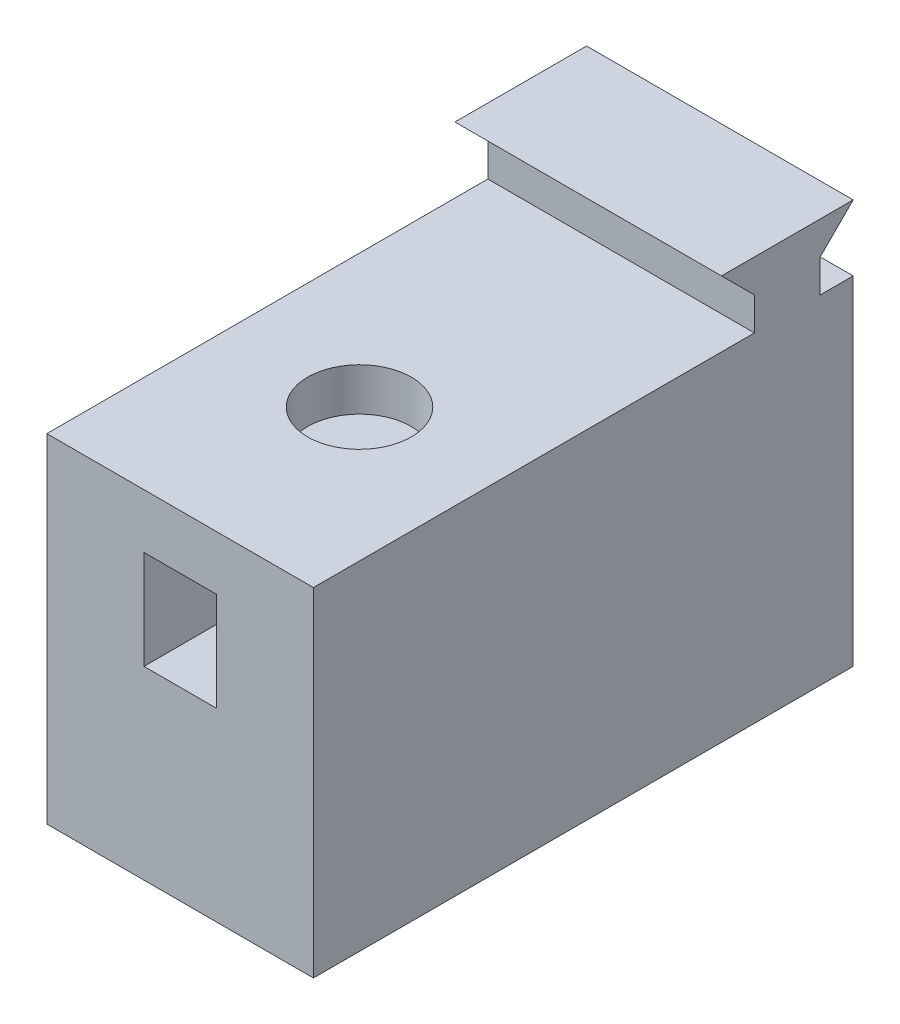
ISO-10303-21;
HEADER;
FILE_DESCRIPTION(('STEP AP214'),'2;1');
FILE_NAME('part.step','',(''),(''),'','','');
FILE_SCHEMA(('AUTOMOTIVE_DESIGN { 1 0 10303 214 1 1 1 1 }'));
ENDSEC;
DATA;
#1=APPLICATION_CONTEXT('core data for automotive mechanical design processes');
#2=APPLICATION_PROTOCOL_DEFINITION('international standard','automotive_design',2000,#1);
#3=PRODUCT_CONTEXT('',#1,'mechanical');
#4=PRODUCT('Part','Part','',(#3));
#5=PRODUCT_RELATED_PRODUCT_CATEGORY('part','',(#4));
#6=PRODUCT_DEFINITION_FORMATION('','',#4);
#7=PRODUCT_DEFINITION_CONTEXT('part definition',#1,'design');
#8=PRODUCT_DEFINITION('design','',#6,#7);
#9=PRODUCT_DEFINITION_SHAPE('','',#8);
#10=(LENGTH_UNIT() NAMED_UNIT(*) SI_UNIT(.MILLI.,.METRE.));
#11=(NAMED_UNIT(*) PLANE_ANGLE_UNIT() SI_UNIT($,.RADIAN.));
#12=(NAMED_UNIT(*) SI_UNIT($,.STERADIAN.) SOLID_ANGLE_UNIT());
#13=UNCERTAINTY_MEASURE_WITH_UNIT(LENGTH_MEASURE(1.E-05),#10,'distance_accuracy_value','');
#14=(GEOMETRIC_REPRESENTATION_CONTEXT(3) GLOBAL_UNCERTAINTY_ASSIGNED_CONTEXT((#13)) GLOBAL_UNIT_ASSIGNED_CONTEXT((#10,
#11,#12)) REPRESENTATION_CONTEXT('',''));
#15=CARTESIAN_POINT('',(0.,0.,0.));
#16=DIRECTION('',(0.,0.,1.));
#17=DIRECTION('',(1.,0.,0.));
#18=AXIS2_PLACEMENT_3D('',#15,#16,#17);
#19=CARTESIAN_POINT('',(0.,-45.8,0.));
#20=DIRECTION('',(0.,-1.,0.));
#21=DIRECTION('',(0.,0.,-1.));
#22=AXIS2_PLACEMENT_3D('',#19,#20,#21);
#23=PLANE('',#22);
#24=DIRECTION('',(-1.,0.,0.));
#25=VECTOR('',#24,1.);
#26=CARTESIAN_POINT('',(0.,-45.8,-19.9));
#27=LINE('',#26,#25);
#28=CARTESIAN_POINT('',(-76.9,-45.8,-19.9));
#29=VERTEX_POINT('',#28);
#30=CARTESIAN_POINT('',(-93.1,-45.8,-19.9));
#31=VERTEX_POINT('',#30);
#32=EDGE_CURVE('E11',#29,#31,#27,.T.);
#33=ORIENTED_EDGE('',*,*,#32,.F.);
#34=DIRECTION('',(0.,0.,-1.));
#35=VECTOR('',#34,1.);
#36=CARTESIAN_POINT('',(-76.9,-45.8,10.9));
#37=LINE('',#36,#35);
#38=CARTESIAN_POINT('',(-76.9,-45.8,-21.9));
#39=VERTEX_POINT('',#38);
#40=EDGE_CURVE('E333',#29,#39,#37,.T.);
#41=ORIENTED_EDGE('',*,*,#40,.T.);
#42=DIRECTION('',(-1.,0.,0.));
#43=VECTOR('',#42,1.);
#44=CARTESIAN_POINT('',(-93.1,-45.8,-21.9));
#45=LINE('',#44,#43);
#46=CARTESIAN_POINT('',(-93.1,-45.8,-21.9));
#47=VERTEX_POINT('',#46);
#48=EDGE_CURVE('E337',#39,#47,#45,.T.);
#49=ORIENTED_EDGE('',*,*,#48,.T.);
#50=DIRECTION('',(0.,0.,1.));
#51=VECTOR('',#50,1.);
#52=CARTESIAN_POINT('',(-93.1,-45.8,10.9));
#53=LINE('',#52,#51);
#54=EDGE_CURVE('E326',#47,#31,#53,.T.);
#55=ORIENTED_EDGE('',*,*,#54,.T.);
#56=EDGE_LOOP('',(#33,#41,#49,#55));
#57=FACE_BOUND('',#56,.T.);
#58=ADVANCED_FACE('F39',(#57),#23,.F.);
#59=CARTESIAN_POINT('',(-85.,-45.8,0.));
#60=DIRECTION('',(0.,1.,0.));
#61=DIRECTION('',(0.,0.,1.));
#62=AXIS2_PLACEMENT_3D('',#59,#60,#61);
#63=CIRCLE('',#62,3.15);
#64=CARTESIAN_POINT('',(-85.,-45.8,3.15));
#65=VERTEX_POINT('',#64);
#66=EDGE_CURVE('E204',#65,#65,#63,.T.);
#67=ORIENTED_EDGE('',*,*,#66,.F.);
#68=EDGE_LOOP('',(#67));
#69=FACE_BOUND('',#68,.T.);
#70=DIRECTION('',(1.,0.,0.));
#71=VECTOR('',#70,1.);
#72=CARTESIAN_POINT('',(0.,-45.8,-15.9));
#73=LINE('',#72,#71);
#74=CARTESIAN_POINT('',(-93.1,-45.8,-15.9));
#75=VERTEX_POINT('',#74);
#76=CARTESIAN_POINT('',(-76.9,-45.8,-15.9));
#77=VERTEX_POINT('',#76);
#78=EDGE_CURVE('E48',#75,#77,#73,.T.);
#79=ORIENTED_EDGE('',*,*,#78,.F.);
#80=CARTESIAN_POINT('',(-93.1,-45.8,10.9));
#81=VERTEX_POINT('',#80);
#82=EDGE_CURVE('E330',#75,#81,#53,.T.);
#83=ORIENTED_EDGE('',*,*,#82,.T.);
#84=DIRECTION('',(1.,0.,0.));
#85=VECTOR('',#84,1.);
#86=CARTESIAN_POINT('',(-93.1,-45.8,10.9));
#87=LINE('',#86,#85);
#88=CARTESIAN_POINT('',(-76.9,-45.8,10.9));
#89=VERTEX_POINT('',#88);
#90=EDGE_CURVE('E329',#81,#89,#87,.T.);
#91=ORIENTED_EDGE('',*,*,#90,.T.);
#92=EDGE_CURVE('E334',#89,#77,#37,.T.);
#93=ORIENTED_EDGE('',*,*,#92,.T.);
#94=EDGE_LOOP('',(#79,#83,#91,#93));
#95=FACE_BOUND('',#94,.T.);
#96=ADVANCED_FACE('F423',(#69,#95),#23,.F.);
#97=CARTESIAN_POINT('',(-93.1,-45.8,10.9));
#98=DIRECTION('',(1.,0.,0.));
#99=DIRECTION('',(0.,0.,-1.));
#100=AXIS2_PLACEMENT_3D('',#97,#98,#99);
#101=PLANE('',#100);
#102=ORIENTED_EDGE('',*,*,#82,.F.);
#103=DIRECTION('',(0.,-1.,0.));
#104=VECTOR('',#103,1.);
#105=CARTESIAN_POINT('',(-93.1,-46.3,-15.9));
#106=LINE('',#105,#104);
#107=CARTESIAN_POINT('',(-93.1,-43.8,-15.9));
#108=VERTEX_POINT('',#107);
#109=EDGE_CURVE('E282',#108,#75,#106,.T.);
#110=ORIENTED_EDGE('',*,*,#109,.F.);
#111=DIRECTION('',(0.,-0.707106781186546,-0.707106781186549));
#112=VECTOR('',#111,1.);
#113=CARTESIAN_POINT('',(-93.1,-43.8,-15.9));
#114=LINE('',#113,#112);
#115=CARTESIAN_POINT('',(-93.1,-41.8,-13.9));
#116=VERTEX_POINT('',#115);
#117=EDGE_CURVE('E304',#116,#108,#114,.T.);
#118=ORIENTED_EDGE('',*,*,#117,.F.);
#119=DIRECTION('',(0.,0.,1.));
#120=VECTOR('',#119,1.);
#121=CARTESIAN_POINT('',(-93.1,-41.8,-13.9));
#122=LINE('',#121,#120);
#123=CARTESIAN_POINT('',(-93.1,-41.8,-21.9));
#124=VERTEX_POINT('',#123);
#125=EDGE_CURVE('E301',#124,#116,#122,.T.);
#126=ORIENTED_EDGE('',*,*,#125,.F.);
#127=DIRECTION('',(0.,0.707106781186554,-0.707106781186541));
#128=VECTOR('',#127,1.);
#129=CARTESIAN_POINT('',(-93.1,-41.8,-21.9));
#130=LINE('',#129,#128);
#131=CARTESIAN_POINT('',(-93.1,-43.8,-19.9));
#132=VERTEX_POINT('',#131);
#133=EDGE_CURVE('E298',#132,#124,#130,.T.);
#134=ORIENTED_EDGE('',*,*,#133,.F.);
#135=DIRECTION('',(0.,1.,0.));
#136=VECTOR('',#135,1.);
#137=CARTESIAN_POINT('',(-93.1,-43.8,-19.9));
#138=LINE('',#137,#136);
#139=EDGE_CURVE('E268',#31,#132,#138,.T.);
#140=ORIENTED_EDGE('',*,*,#139,.F.);
#141=ORIENTED_EDGE('',*,*,#54,.F.);
#142=DIRECTION('',(0.,-1.,0.));
#143=VECTOR('',#142,1.);
#144=CARTESIAN_POINT('',(-93.1,-45.8,-21.9));
#145=LINE('',#144,#143);
#146=CARTESIAN_POINT('',(-93.1,-66.35,-21.9));
#147=VERTEX_POINT('',#146);
#148=EDGE_CURVE('E340',#47,#147,#145,.T.);
#149=ORIENTED_EDGE('',*,*,#148,.T.);
#150=DIRECTION('',(0.,0.,1.));
#151=VECTOR('',#150,1.);
#152=CARTESIAN_POINT('',(-93.1,-66.35,10.9));
#153=LINE('',#152,#151);
#154=CARTESIAN_POINT('',(-93.1,-66.35,10.9));
#155=VERTEX_POINT('',#154);
#156=EDGE_CURVE('E325',#147,#155,#153,.T.);
#157=ORIENTED_EDGE('',*,*,#156,.T.);
#158=DIRECTION('',(0.,-1.,0.));
#159=VECTOR('',#158,1.);
#160=CARTESIAN_POINT('',(-93.1,-45.8,10.9));
#161=LINE('',#160,#159);
#162=EDGE_CURVE('E364',#81,#155,#161,.T.);
#163=ORIENTED_EDGE('',*,*,#162,.F.);
#164=EDGE_LOOP('',(#102,#110,#118,#126,#134,#140,#141,#149,#157,#163));
#165=FACE_BOUND('',#164,.T.);
#166=ADVANCED_FACE('F41',(#165),#101,.F.);
#167=CARTESIAN_POINT('',(-93.1,-45.8,10.9));
#168=DIRECTION('',(0.,0.,-1.));
#169=DIRECTION('',(-1.,0.,0.));
#170=AXIS2_PLACEMENT_3D('',#167,#168,#169);
#171=PLANE('',#170);
#172=DIRECTION('',(1.,0.,0.));
#173=VECTOR('',#172,1.);
#174=CARTESIAN_POINT('',(-87.2,-55.1,10.9));
#175=LINE('',#174,#173);
#176=CARTESIAN_POINT('',(-87.2,-55.1,10.9));
#177=VERTEX_POINT('',#176);
#178=CARTESIAN_POINT('',(-82.8,-55.1,10.9));
#179=VERTEX_POINT('',#178);
#180=EDGE_CURVE('E195',#177,#179,#175,.T.);
#181=ORIENTED_EDGE('',*,*,#180,.F.);
#182=DIRECTION('',(0.,-1.,0.));
#183=VECTOR('',#182,1.);
#184=CARTESIAN_POINT('',(-87.2,-55.1,10.9));
#185=LINE('',#184,#183);
#186=CARTESIAN_POINT('',(-87.2,-49.1,10.9));
#187=VERTEX_POINT('',#186);
#188=EDGE_CURVE('E55',#187,#177,#185,.T.);
#189=ORIENTED_EDGE('',*,*,#188,.F.);
#190=DIRECTION('',(-1.,0.,0.));
#191=VECTOR('',#190,1.);
#192=CARTESIAN_POINT('',(-87.2,-49.1,10.9));
#193=LINE('',#192,#191);
#194=CARTESIAN_POINT('',(-82.8,-49.1,10.9));
#195=VERTEX_POINT('',#194);
#196=EDGE_CURVE('E184',#195,#187,#193,.T.);
#197=ORIENTED_EDGE('',*,*,#196,.F.);
#198=DIRECTION('',(0.,1.,0.));
#199=VECTOR('',#198,1.);
#200=CARTESIAN_POINT('',(-82.8,-55.1,10.9));
#201=LINE('',#200,#199);
#202=EDGE_CURVE('E188',#179,#195,#201,.T.);
#203=ORIENTED_EDGE('',*,*,#202,.F.);
#204=EDGE_LOOP('',(#181,#189,#197,#203));
#205=FACE_BOUND('',#204,.T.);
#206=DIRECTION('',(1.,0.,0.));
#207=VECTOR('',#206,1.);
#208=CARTESIAN_POINT('',(-93.1,-66.35,10.9));
#209=LINE('',#208,#207);
#210=CARTESIAN_POINT('',(-76.9,-66.35,10.9));
#211=VERTEX_POINT('',#210);
#212=EDGE_CURVE('E344',#155,#211,#209,.T.);
#213=ORIENTED_EDGE('',*,*,#212,.T.);
#214=DIRECTION('',(0.,-1.,0.));
#215=VECTOR('',#214,1.);
#216=CARTESIAN_POINT('',(-76.9,-45.8,10.9));
#217=LINE('',#216,#215);
#218=EDGE_CURVE('E360',#89,#211,#217,.T.);
#219=ORIENTED_EDGE('',*,*,#218,.F.);
#220=ORIENTED_EDGE('',*,*,#90,.F.);
#221=ORIENTED_EDGE('',*,*,#162,.T.);
#222=EDGE_LOOP('',(#213,#219,#220,#221));
#223=FACE_BOUND('',#222,.T.);
#224=ADVANCED_FACE('F442',(#205,#223),#171,.F.);
#225=CARTESIAN_POINT('',(-76.9,-45.8,10.9));
#226=DIRECTION('',(-1.,0.,0.));
#227=DIRECTION('',(0.,0.,1.));
#228=AXIS2_PLACEMENT_3D('',#225,#226,#227);
#229=PLANE('',#228);
#230=ORIENTED_EDGE('',*,*,#40,.F.);
#231=DIRECTION('',(0.,1.,0.));
#232=VECTOR('',#231,1.);
#233=CARTESIAN_POINT('',(-76.9,-43.8,-19.9));
#234=LINE('',#233,#232);
#235=CARTESIAN_POINT('',(-76.9,-43.8,-19.9));
#236=VERTEX_POINT('',#235);
#237=EDGE_CURVE('E278',#29,#236,#234,.T.);
#238=ORIENTED_EDGE('',*,*,#237,.T.);
#239=DIRECTION('',(0.,0.707106781186554,-0.707106781186541));
#240=VECTOR('',#239,1.);
#241=CARTESIAN_POINT('',(-76.9,-41.8,-21.9));
#242=LINE('',#241,#240);
#243=CARTESIAN_POINT('',(-76.9,-41.8,-21.9));
#244=VERTEX_POINT('',#243);
#245=EDGE_CURVE('E281',#236,#244,#242,.T.);
#246=ORIENTED_EDGE('',*,*,#245,.T.);
#247=DIRECTION('',(0.,0.,1.));
#248=VECTOR('',#247,1.);
#249=CARTESIAN_POINT('',(-76.9,-41.8,-13.9));
#250=LINE('',#249,#248);
#251=CARTESIAN_POINT('',(-76.9,-41.8,-13.9));
#252=VERTEX_POINT('',#251);
#253=EDGE_CURVE('E285',#244,#252,#250,.T.);
#254=ORIENTED_EDGE('',*,*,#253,.T.);
#255=DIRECTION('',(0.,-0.707106781186546,-0.707106781186549));
#256=VECTOR('',#255,1.);
#257=CARTESIAN_POINT('',(-76.9,-43.8,-15.9));
#258=LINE('',#257,#256);
#259=CARTESIAN_POINT('',(-76.9,-43.8,-15.9));
#260=VERTEX_POINT('',#259);
#261=EDGE_CURVE('E288',#252,#260,#258,.T.);
#262=ORIENTED_EDGE('',*,*,#261,.T.);
#263=DIRECTION('',(0.,-1.,0.));
#264=VECTOR('',#263,1.);
#265=CARTESIAN_POINT('',(-76.9,-46.3,-15.9));
#266=LINE('',#265,#264);
#267=EDGE_CURVE('E291',#260,#77,#266,.T.);
#268=ORIENTED_EDGE('',*,*,#267,.T.);
#269=ORIENTED_EDGE('',*,*,#92,.F.);
#270=ORIENTED_EDGE('',*,*,#218,.T.);
#271=DIRECTION('',(0.,0.,-1.));
#272=VECTOR('',#271,1.);
#273=CARTESIAN_POINT('',(-76.9,-66.35,10.9));
#274=LINE('',#273,#272);
#275=CARTESIAN_POINT('',(-76.9,-66.35,-21.9));
#276=VERTEX_POINT('',#275);
#277=EDGE_CURVE('E347',#211,#276,#274,.T.);
#278=ORIENTED_EDGE('',*,*,#277,.T.);
#279=DIRECTION('',(0.,-1.,0.));
#280=VECTOR('',#279,1.);
#281=CARTESIAN_POINT('',(-76.9,-45.8,-21.9));
#282=LINE('',#281,#280);
#283=EDGE_CURVE('E356',#39,#276,#282,.T.);
#284=ORIENTED_EDGE('',*,*,#283,.F.);
#285=EDGE_LOOP('',(#230,#238,#246,#254,#262,#268,#269,#270,#278,#284));
#286=FACE_BOUND('',#285,.T.);
#287=ADVANCED_FACE('F378',(#286),#229,.F.);
#288=CARTESIAN_POINT('',(-93.1,-45.8,-21.9));
#289=DIRECTION('',(0.,0.,1.));
#290=DIRECTION('',(1.,0.,0.));
#291=AXIS2_PLACEMENT_3D('',#288,#289,#290);
#292=PLANE('',#291);
#293=DIRECTION('',(-1.,0.,0.));
#294=VECTOR('',#293,1.);
#295=CARTESIAN_POINT('',(-93.1,-66.35,-21.9));
#296=LINE('',#295,#294);
#297=EDGE_CURVE('E350',#276,#147,#296,.T.);
#298=ORIENTED_EDGE('',*,*,#297,.T.);
#299=ORIENTED_EDGE('',*,*,#148,.F.);
#300=ORIENTED_EDGE('',*,*,#48,.F.);
#301=ORIENTED_EDGE('',*,*,#283,.T.);
#302=EDGE_LOOP('',(#298,#299,#300,#301));
#303=FACE_BOUND('',#302,.T.);
#304=ADVANCED_FACE('F436',(#303),#292,.F.);
#305=CARTESIAN_POINT('',(0.,-66.35,0.));
#306=DIRECTION('',(0.,-1.,0.));
#307=DIRECTION('',(0.,0.,-1.));
#308=AXIS2_PLACEMENT_3D('',#305,#306,#307);
#309=PLANE('',#308);
#310=CARTESIAN_POINT('',(-85.,-66.35,8.25));
#311=DIRECTION('',(0.,1.,0.));
#312=DIRECTION('',(0.,0.,1.));
#313=AXIS2_PLACEMENT_3D('',#310,#311,#312);
#314=CIRCLE('',#313,1.);
#315=CARTESIAN_POINT('',(-85.,-66.35,9.25));
#316=VERTEX_POINT('',#315);
#317=EDGE_CURVE('E218',#316,#316,#314,.T.);
#318=ORIENTED_EDGE('',*,*,#317,.T.);
#319=EDGE_LOOP('',(#318));
#320=FACE_BOUND('',#319,.T.);
#321=CARTESIAN_POINT('',(-85.,-66.35,-19.25));
#322=DIRECTION('',(0.,1.,0.));
#323=DIRECTION('',(0.,0.,1.));
#324=AXIS2_PLACEMENT_3D('',#321,#322,#323);
#325=CIRCLE('',#324,1.);
#326=CARTESIAN_POINT('',(-85.,-66.35,-18.25));
#327=VERTEX_POINT('',#326);
#328=EDGE_CURVE('E226',#327,#327,#325,.T.);
#329=ORIENTED_EDGE('',*,*,#328,.T.);
#330=EDGE_LOOP('',(#329));
#331=FACE_BOUND('',#330,.T.);
#332=DIRECTION('',(0.,0.,1.));
#333=VECTOR('',#332,1.);
#334=CARTESIAN_POINT('',(-91.5,-66.35,6.1));
#335=LINE('',#334,#333);
#336=CARTESIAN_POINT('',(-91.5,-66.35,-17.1));
#337=VERTEX_POINT('',#336);
#338=CARTESIAN_POINT('',(-91.5,-66.35,6.1));
#339=VERTEX_POINT('',#338);
#340=EDGE_CURVE('E234',#337,#339,#335,.T.);
#341=ORIENTED_EDGE('',*,*,#340,.T.);
#342=DIRECTION('',(1.,0.,0.));
#343=VECTOR('',#342,1.);
#344=CARTESIAN_POINT('',(-91.5,-66.35,6.1));
#345=LINE('',#344,#343);
#346=CARTESIAN_POINT('',(-78.5,-66.35,6.1));
#347=VERTEX_POINT('',#346);
#348=EDGE_CURVE('E238',#339,#347,#345,.T.);
#349=ORIENTED_EDGE('',*,*,#348,.T.);
#350=DIRECTION('',(0.,0.,-1.));
#351=VECTOR('',#350,1.);
#352=CARTESIAN_POINT('',(-78.5,-66.35,6.1));
#353=LINE('',#352,#351);
#354=CARTESIAN_POINT('',(-78.5,-66.35,-17.1));
#355=VERTEX_POINT('',#354);
#356=EDGE_CURVE('E243',#347,#355,#353,.T.);
#357=ORIENTED_EDGE('',*,*,#356,.T.);
#358=DIRECTION('',(-1.,0.,0.));
#359=VECTOR('',#358,1.);
#360=CARTESIAN_POINT('',(-91.5,-66.35,-17.1));
#361=LINE('',#360,#359);
#362=EDGE_CURVE('E247',#355,#337,#361,.T.);
#363=ORIENTED_EDGE('',*,*,#362,.T.);
#364=EDGE_LOOP('',(#341,#349,#357,#363));
#365=FACE_BOUND('',#364,.T.);
#366=ORIENTED_EDGE('',*,*,#156,.F.);
#367=ORIENTED_EDGE('',*,*,#297,.F.);
#368=ORIENTED_EDGE('',*,*,#277,.F.);
#369=ORIENTED_EDGE('',*,*,#212,.F.);
#370=EDGE_LOOP('',(#366,#367,#368,#369));
#371=FACE_BOUND('',#370,.T.);
#372=ADVANCED_FACE('F407',(#320,#331,#365,#371),#309,.T.);
#373=CARTESIAN_POINT('',(-76.9,-43.8,-19.9));
#374=DIRECTION('',(0.,0.,1.));
#375=DIRECTION('',(1.,0.,0.));
#376=AXIS2_PLACEMENT_3D('',#373,#374,#375);
#377=PLANE('',#376);
#378=ORIENTED_EDGE('',*,*,#237,.F.);
#379=ORIENTED_EDGE('',*,*,#32,.T.);
#380=ORIENTED_EDGE('',*,*,#139,.T.);
#381=DIRECTION('',(-1.,0.,0.));
#382=VECTOR('',#381,1.);
#383=CARTESIAN_POINT('',(-76.9,-43.8,-19.9));
#384=LINE('',#383,#382);
#385=EDGE_CURVE('E321',#236,#132,#384,.T.);
#386=ORIENTED_EDGE('',*,*,#385,.F.);
#387=EDGE_LOOP('',(#378,#379,#380,#386));
#388=FACE_BOUND('',#387,.T.);
#389=ADVANCED_FACE('F432',(#388),#377,.F.);
#390=CARTESIAN_POINT('',(-76.9,-46.3,-15.9));
#391=DIRECTION('',(0.,0.,-1.));
#392=DIRECTION('',(-1.,0.,0.));
#393=AXIS2_PLACEMENT_3D('',#390,#391,#392);
#394=PLANE('',#393);
#395=ORIENTED_EDGE('',*,*,#109,.T.);
#396=ORIENTED_EDGE('',*,*,#78,.T.);
#397=ORIENTED_EDGE('',*,*,#267,.F.);
#398=DIRECTION('',(-1.,0.,0.));
#399=VECTOR('',#398,1.);
#400=CARTESIAN_POINT('',(-76.9,-43.8,-15.9));
#401=LINE('',#400,#399);
#402=EDGE_CURVE('E295',#260,#108,#401,.T.);
#403=ORIENTED_EDGE('',*,*,#402,.T.);
#404=EDGE_LOOP('',(#395,#396,#397,#403));
#405=FACE_BOUND('',#404,.T.);
#406=ADVANCED_FACE('F372',(#405),#394,.F.);
#407=CARTESIAN_POINT('',(-76.9,-41.8,-21.9));
#408=DIRECTION('',(0.,0.707106781186541,0.707106781186554));
#409=DIRECTION('',(0.,-0.707106781186554,0.707106781186541));
#410=AXIS2_PLACEMENT_3D('',#407,#408,#409);
#411=PLANE('',#410);
#412=ORIENTED_EDGE('',*,*,#133,.T.);
#413=DIRECTION('',(-1.,0.,0.));
#414=VECTOR('',#413,1.);
#415=CARTESIAN_POINT('',(-76.9,-41.8,-21.9));
#416=LINE('',#415,#414);
#417=EDGE_CURVE('E317',#244,#124,#416,.T.);
#418=ORIENTED_EDGE('',*,*,#417,.F.);
#419=ORIENTED_EDGE('',*,*,#245,.F.);
#420=ORIENTED_EDGE('',*,*,#385,.T.);
#421=EDGE_LOOP('',(#412,#418,#419,#420));
#422=FACE_BOUND('',#421,.T.);
#423=ADVANCED_FACE('F466',(#422),#411,.F.);
#424=CARTESIAN_POINT('',(-76.9,-41.8,-13.9));
#425=DIRECTION('',(0.,-1.,0.));
#426=DIRECTION('',(0.,0.,-1.));
#427=AXIS2_PLACEMENT_3D('',#424,#425,#426);
#428=PLANE('',#427);
#429=ORIENTED_EDGE('',*,*,#125,.T.);
#430=DIRECTION('',(-1.,0.,0.));
#431=VECTOR('',#430,1.);
#432=CARTESIAN_POINT('',(-76.9,-41.8,-13.9));
#433=LINE('',#432,#431);
#434=EDGE_CURVE('E313',#252,#116,#433,.T.);
#435=ORIENTED_EDGE('',*,*,#434,.F.);
#436=ORIENTED_EDGE('',*,*,#253,.F.);
#437=ORIENTED_EDGE('',*,*,#417,.T.);
#438=EDGE_LOOP('',(#429,#435,#436,#437));
#439=FACE_BOUND('',#438,.T.);
#440=ADVANCED_FACE('F418',(#439),#428,.F.);
#441=CARTESIAN_POINT('',(-76.9,-43.8,-15.9));
#442=DIRECTION('',(0.,0.707106781186549,-0.707106781186546));
#443=DIRECTION('',(0.,0.707106781186546,0.707106781186549));
#444=AXIS2_PLACEMENT_3D('',#441,#442,#443);
#445=PLANE('',#444);
#446=ORIENTED_EDGE('',*,*,#117,.T.);
#447=ORIENTED_EDGE('',*,*,#402,.F.);
#448=ORIENTED_EDGE('',*,*,#261,.F.);
#449=ORIENTED_EDGE('',*,*,#434,.T.);
#450=EDGE_LOOP('',(#446,#447,#448,#449));
#451=FACE_BOUND('',#450,.T.);
#452=ADVANCED_FACE('F384',(#451),#445,.F.);
#453=CARTESIAN_POINT('',(-91.5,-66.35,6.1));
#454=DIRECTION('',(-1.,0.,0.));
#455=DIRECTION('',(0.,0.,1.));
#456=AXIS2_PLACEMENT_3D('',#453,#454,#455);
#457=PLANE('',#456);
#458=DIRECTION('',(0.,0.,1.));
#459=VECTOR('',#458,1.);
#460=CARTESIAN_POINT('',(-91.5,-49.1,6.1));
#461=LINE('',#460,#459);
#462=CARTESIAN_POINT('',(-91.5,-49.1,-17.1));
#463=VERTEX_POINT('',#462);
#464=CARTESIAN_POINT('',(-91.5,-49.1,6.1));
#465=VERTEX_POINT('',#464);
#466=EDGE_CURVE('E230',#463,#465,#461,.T.);
#467=ORIENTED_EDGE('',*,*,#466,.T.);
#468=DIRECTION('',(0.,1.,0.));
#469=VECTOR('',#468,1.);
#470=CARTESIAN_POINT('',(-91.5,-66.35,6.1));
#471=LINE('',#470,#469);
#472=EDGE_CURVE('E251',#339,#465,#471,.T.);
#473=ORIENTED_EDGE('',*,*,#472,.F.);
#474=ORIENTED_EDGE('',*,*,#340,.F.);
#475=DIRECTION('',(0.,1.,0.));
#476=VECTOR('',#475,1.);
#477=CARTESIAN_POINT('',(-91.5,-66.35,-17.1));
#478=LINE('',#477,#476);
#479=EDGE_CURVE('E265',#337,#463,#478,.T.);
#480=ORIENTED_EDGE('',*,*,#479,.T.);
#481=EDGE_LOOP('',(#467,#473,#474,#480));
#482=FACE_BOUND('',#481,.T.);
#483=ADVANCED_FACE('F410',(#482),#457,.F.);
#484=CARTESIAN_POINT('',(-91.5,-66.35,-17.1));
#485=DIRECTION('',(0.,0.,-1.));
#486=DIRECTION('',(-1.,0.,0.));
#487=AXIS2_PLACEMENT_3D('',#484,#485,#486);
#488=PLANE('',#487);
#489=DIRECTION('',(-1.,0.,0.));
#490=VECTOR('',#489,1.);
#491=CARTESIAN_POINT('',(-91.5,-49.1,-17.1));
#492=LINE('',#491,#490);
#493=CARTESIAN_POINT('',(-78.5,-49.1,-17.1));
#494=VERTEX_POINT('',#493);
#495=EDGE_CURVE('E239',#494,#463,#492,.T.);
#496=ORIENTED_EDGE('',*,*,#495,.T.);
#497=ORIENTED_EDGE('',*,*,#479,.F.);
#498=ORIENTED_EDGE('',*,*,#362,.F.);
#499=DIRECTION('',(0.,1.,0.));
#500=VECTOR('',#499,1.);
#501=CARTESIAN_POINT('',(-78.5,-66.35,-17.1));
#502=LINE('',#501,#500);
#503=EDGE_CURVE('E269',#355,#494,#502,.T.);
#504=ORIENTED_EDGE('',*,*,#503,.T.);
#505=EDGE_LOOP('',(#496,#497,#498,#504));
#506=FACE_BOUND('',#505,.T.);
#507=ADVANCED_FACE('F403',(#506),#488,.F.);
#508=CARTESIAN_POINT('',(-78.5,-66.35,6.1));
#509=DIRECTION('',(1.,0.,0.));
#510=DIRECTION('',(0.,0.,-1.));
#511=AXIS2_PLACEMENT_3D('',#508,#509,#510);
#512=PLANE('',#511);
#513=DIRECTION('',(0.,0.,-1.));
#514=VECTOR('',#513,1.);
#515=CARTESIAN_POINT('',(-78.5,-49.1,6.1));
#516=LINE('',#515,#514);
#517=CARTESIAN_POINT('',(-78.5,-49.1,6.1));
#518=VERTEX_POINT('',#517);
#519=EDGE_CURVE('E258',#518,#494,#516,.T.);
#520=ORIENTED_EDGE('',*,*,#519,.T.);
#521=ORIENTED_EDGE('',*,*,#503,.F.);
#522=ORIENTED_EDGE('',*,*,#356,.F.);
#523=DIRECTION('',(0.,1.,0.));
#524=VECTOR('',#523,1.);
#525=CARTESIAN_POINT('',(-78.5,-66.35,6.1));
#526=LINE('',#525,#524);
#527=EDGE_CURVE('E272',#347,#518,#526,.T.);
#528=ORIENTED_EDGE('',*,*,#527,.T.);
#529=EDGE_LOOP('',(#520,#521,#522,#528));
#530=FACE_BOUND('',#529,.T.);
#531=ADVANCED_FACE('F398',(#530),#512,.F.);
#532=CARTESIAN_POINT('',(-91.5,-66.35,6.1));
#533=DIRECTION('',(0.,0.,1.));
#534=DIRECTION('',(1.,0.,0.));
#535=AXIS2_PLACEMENT_3D('',#532,#533,#534);
#536=PLANE('',#535);
#537=DIRECTION('',(1.,0.,0.));
#538=VECTOR('',#537,1.);
#539=CARTESIAN_POINT('',(-91.5,-49.1,6.1));
#540=LINE('',#539,#538);
#541=CARTESIAN_POINT('',(-87.2,-49.1,6.1));
#542=VERTEX_POINT('',#541);
#543=EDGE_CURVE('E182',#465,#542,#540,.T.);
#544=ORIENTED_EDGE('',*,*,#543,.T.);
#545=DIRECTION('',(0.,-1.,0.));
#546=VECTOR('',#545,1.);
#547=CARTESIAN_POINT('',(-87.2,-55.1,6.1));
#548=LINE('',#547,#546);
#549=CARTESIAN_POINT('',(-87.2,-55.1,6.1));
#550=VERTEX_POINT('',#549);
#551=EDGE_CURVE('E60',#542,#550,#548,.T.);
#552=ORIENTED_EDGE('',*,*,#551,.T.);
#553=DIRECTION('',(1.,0.,0.));
#554=VECTOR('',#553,1.);
#555=CARTESIAN_POINT('',(-87.2,-55.1,6.1));
#556=LINE('',#555,#554);
#557=CARTESIAN_POINT('',(-82.8,-55.1,6.1));
#558=VERTEX_POINT('',#557);
#559=EDGE_CURVE('E172',#550,#558,#556,.T.);
#560=ORIENTED_EDGE('',*,*,#559,.T.);
#561=DIRECTION('',(0.,1.,0.));
#562=VECTOR('',#561,1.);
#563=CARTESIAN_POINT('',(-82.8,-55.1,6.1));
#564=LINE('',#563,#562);
#565=CARTESIAN_POINT('',(-82.8,-49.1,6.1));
#566=VERTEX_POINT('',#565);
#567=EDGE_CURVE('E169',#558,#566,#564,.T.);
#568=ORIENTED_EDGE('',*,*,#567,.T.);
#569=EDGE_CURVE('E255',#566,#518,#540,.T.);
#570=ORIENTED_EDGE('',*,*,#569,.T.);
#571=ORIENTED_EDGE('',*,*,#527,.F.);
#572=ORIENTED_EDGE('',*,*,#348,.F.);
#573=ORIENTED_EDGE('',*,*,#472,.T.);
#574=EDGE_LOOP('',(#544,#552,#560,#568,#570,#571,#572,#573));
#575=FACE_BOUND('',#574,.T.);
#576=ADVANCED_FACE('F180',(#575),#536,.F.);
#577=CARTESIAN_POINT('',(0.,-49.1,0.));
#578=DIRECTION('',(0.,-1.,0.));
#579=DIRECTION('',(0.,0.,-1.));
#580=AXIS2_PLACEMENT_3D('',#577,#578,#579);
#581=PLANE('',#580);
#582=ORIENTED_EDGE('',*,*,#466,.F.);
#583=ORIENTED_EDGE('',*,*,#495,.F.);
#584=ORIENTED_EDGE('',*,*,#519,.F.);
#585=ORIENTED_EDGE('',*,*,#569,.F.);
#586=DIRECTION('',(0.,0.,1.));
#587=VECTOR('',#586,1.);
#588=CARTESIAN_POINT('',(-82.8,-49.1,6.1));
#589=LINE('',#588,#587);
#590=EDGE_CURVE('E205',#566,#195,#589,.T.);
#591=ORIENTED_EDGE('',*,*,#590,.T.);
#592=ORIENTED_EDGE('',*,*,#196,.T.);
#593=DIRECTION('',(0.,0.,1.));
#594=VECTOR('',#593,1.);
#595=CARTESIAN_POINT('',(-87.2,-49.1,6.1));
#596=LINE('',#595,#594);
#597=EDGE_CURVE('E201',#542,#187,#596,.T.);
#598=ORIENTED_EDGE('',*,*,#597,.F.);
#599=ORIENTED_EDGE('',*,*,#543,.F.);
#600=EDGE_LOOP('',(#582,#583,#584,#585,#591,#592,#598,#599));
#601=FACE_BOUND('',#600,.T.);
#602=ADVANCED_FACE('F401',(#601),#581,.T.);
#603=CARTESIAN_POINT('',(-85.,-66.35,-19.25));
#604=DIRECTION('',(0.,1.,0.));
#605=DIRECTION('',(0.,0.,1.));
#606=AXIS2_PLACEMENT_3D('',#603,#604,#605);
#607=CYLINDRICAL_SURFACE('',#606,1.);
#608=CARTESIAN_POINT('',(-85.,-60.35,-19.25));
#609=DIRECTION('',(0.,1.,0.));
#610=DIRECTION('',(0.,0.,1.));
#611=AXIS2_PLACEMENT_3D('',#608,#609,#610);
#612=CIRCLE('',#611,1.);
#613=CARTESIAN_POINT('',(-85.,-60.35,-18.25));
#614=VERTEX_POINT('',#613);
#615=EDGE_CURVE('E222',#614,#614,#612,.T.);
#616=CARTESIAN_POINT('',(-85.,-66.35,-18.25));
#617=CARTESIAN_POINT('',(-85.,-66.2875,-18.25));
#618=CARTESIAN_POINT('',(-85.,-66.225,-18.25));
#619=CARTESIAN_POINT('',(-85.,-66.1,-18.25));
#620=CARTESIAN_POINT('',(-85.,-66.0375,-18.25));
#621=CARTESIAN_POINT('',(-85.,-65.9125,-18.25));
#622=CARTESIAN_POINT('',(-85.,-65.85,-18.25));
#623=CARTESIAN_POINT('',(-85.,-65.725,-18.25));
#624=CARTESIAN_POINT('',(-85.,-65.6625,-18.25));
#625=CARTESIAN_POINT('',(-85.,-65.5375,-18.25));
#626=CARTESIAN_POINT('',(-85.,-65.475,-18.25));
#627=CARTESIAN_POINT('',(-85.,-65.35,-18.25));
#628=CARTESIAN_POINT('',(-85.,-65.2875,-18.25));
#629=CARTESIAN_POINT('',(-85.,-65.1625,-18.25));
#630=CARTESIAN_POINT('',(-85.,-65.1,-18.25));
#631=CARTESIAN_POINT('',(-85.,-64.975,-18.25));
#632=CARTESIAN_POINT('',(-85.,-64.9125,-18.25));
#633=CARTESIAN_POINT('',(-85.,-64.7875,-18.25));
#634=CARTESIAN_POINT('',(-85.,-64.725,-18.25));
#635=CARTESIAN_POINT('',(-85.,-64.6,-18.25));
#636=CARTESIAN_POINT('',(-85.,-64.5375,-18.25));
#637=CARTESIAN_POINT('',(-85.,-64.4125,-18.25));
#638=CARTESIAN_POINT('',(-85.,-64.35,-18.25));
#639=CARTESIAN_POINT('',(-85.,-64.225,-18.25));
#640=CARTESIAN_POINT('',(-85.,-64.1625,-18.25));
#641=CARTESIAN_POINT('',(-85.,-64.0375,-18.25));
#642=CARTESIAN_POINT('',(-85.,-63.975,-18.25));
#643=CARTESIAN_POINT('',(-85.,-63.85,-18.25));
#644=CARTESIAN_POINT('',(-85.,-63.7875,-18.25));
#645=CARTESIAN_POINT('',(-85.,-63.6625,-18.25));
#646=CARTESIAN_POINT('',(-85.,-63.6,-18.25));
#647=CARTESIAN_POINT('',(-85.,-63.475,-18.25));
#648=CARTESIAN_POINT('',(-85.,-63.4125,-18.25));
#649=CARTESIAN_POINT('',(-85.,-63.2875,-18.25));
#650=CARTESIAN_POINT('',(-85.,-63.225,-18.25));
#651=CARTESIAN_POINT('',(-85.,-63.1,-18.25));
#652=CARTESIAN_POINT('',(-85.,-63.0375,-18.25));
#653=CARTESIAN_POINT('',(-85.,-62.9125,-18.25));
#654=CARTESIAN_POINT('',(-85.,-62.85,-18.25));
#655=CARTESIAN_POINT('',(-85.,-62.725,-18.25));
#656=CARTESIAN_POINT('',(-85.,-62.6625,-18.25));
#657=CARTESIAN_POINT('',(-85.,-62.5375,-18.25));
#658=CARTESIAN_POINT('',(-85.,-62.475,-18.25));
#659=CARTESIAN_POINT('',(-85.,-62.35,-18.25));
#660=CARTESIAN_POINT('',(-85.,-62.2875,-18.25));
#661=CARTESIAN_POINT('',(-85.,-62.1625,-18.25));
#662=CARTESIAN_POINT('',(-85.,-62.1,-18.25));
#663=CARTESIAN_POINT('',(-85.,-61.975,-18.25));
#664=CARTESIAN_POINT('',(-85.,-61.9125,-18.25));
#665=CARTESIAN_POINT('',(-85.,-61.7875,-18.25));
#666=CARTESIAN_POINT('',(-85.,-61.725,-18.25));
#667=CARTESIAN_POINT('',(-85.,-61.6,-18.25));
#668=CARTESIAN_POINT('',(-85.,-61.5375,-18.25));
#669=CARTESIAN_POINT('',(-85.,-61.4125,-18.25));
#670=CARTESIAN_POINT('',(-85.,-61.35,-18.25));
#671=CARTESIAN_POINT('',(-85.,-61.225,-18.25));
#672=CARTESIAN_POINT('',(-85.,-61.1625,-18.25));
#673=CARTESIAN_POINT('',(-85.,-61.0375,-18.25));
#674=CARTESIAN_POINT('',(-85.,-60.975,-18.25));
#675=CARTESIAN_POINT('',(-85.,-60.85,-18.25));
#676=CARTESIAN_POINT('',(-85.,-60.7875,-18.25));
#677=CARTESIAN_POINT('',(-85.,-60.6625,-18.25));
#678=CARTESIAN_POINT('',(-85.,-60.6,-18.25));
#679=CARTESIAN_POINT('',(-85.,-60.475,-18.25));
#680=CARTESIAN_POINT('',(-85.,-60.4125,-18.25));
#681=CARTESIAN_POINT('',(-85.,-60.35,-18.25));
#682=B_SPLINE_CURVE_WITH_KNOTS('',3,(#616,#617,#618,#619,#620,#621,#622,#623,#624,#625,#626,
#627,#628,#629,#630,#631,#632,#633,#634,#635,#636,#637,#638,#639,#640,#641,#642,#643,#644,#645,
#646,#647,#648,#649,#650,#651,#652,#653,#654,#655,#656,#657,#658,#659,#660,#661,#662,#663,#664,
#665,#666,#667,#668,#669,#670,#671,#672,#673,#674,#675,#676,#677,#678,#679,#680,#681),
.UNSPECIFIED.,.F.,.F.,(4,2,2,2,2,2,2,2,2,2,2,2,2,2,2,2,2,2,2,2,2,2,2,2,2,2,2,2,2,2,2,2,4),(0.,
0.187499999999993,0.375,0.562499999999994,0.750000000000001,0.937499999999994,1.125,
1.31249999999999,1.5,1.68749999999999,1.875,2.06249999999999,2.25,2.4375,2.625,2.8125,3.,3.1875,
3.375,3.5625,3.75,3.9375,4.125,4.3125,4.5,4.6875,4.875,5.0625,5.25,5.4375,5.625,5.8125,6.),.UNSPECIFIED.);
#683=EDGE_CURVE('BSEAM548',#327,#614,#682,.T.);
#684=ORIENTED_EDGE('',*,*,#328,.F.);
#685=ORIENTED_EDGE('',*,*,#615,.T.);
#686=ORIENTED_EDGE('',*,*,#683,.T.);
#687=ORIENTED_EDGE('',*,*,#683,.F.);
#688=EDGE_LOOP('',(#684,#686,#685,#687));
#689=FACE_BOUND('',#688,.T.);
#690=ADVANCED_FACE('F548',(#689),#607,.F.);
#691=CARTESIAN_POINT('',(-85.,-60.35,-19.25));
#692=DIRECTION('',(0.,1.,0.));
#693=DIRECTION('',(0.,0.,1.));
#694=AXIS2_PLACEMENT_3D('',#691,#692,#693);
#695=PLANE('',#694);
#696=ORIENTED_EDGE('',*,*,#615,.F.);
#697=EDGE_LOOP('',(#696));
#698=FACE_BOUND('',#697,.T.);
#699=ADVANCED_FACE('F593',(#698),#695,.F.);
#700=CARTESIAN_POINT('',(-85.,-66.35,8.25));
#701=DIRECTION('',(0.,1.,0.));
#702=DIRECTION('',(0.,0.,1.));
#703=AXIS2_PLACEMENT_3D('',#700,#701,#702);
#704=CYLINDRICAL_SURFACE('',#703,1.);
#705=CARTESIAN_POINT('',(-85.,-60.35,8.25));
#706=DIRECTION('',(0.,1.,0.));
#707=DIRECTION('',(0.,0.,1.));
#708=AXIS2_PLACEMENT_3D('',#705,#706,#707);
#709=CIRCLE('',#708,1.);
#710=CARTESIAN_POINT('',(-85.,-60.35,9.25));
#711=VERTEX_POINT('',#710);
#712=EDGE_CURVE('E214',#711,#711,#709,.T.);
#713=CARTESIAN_POINT('',(-85.,-66.35,9.25));
#714=CARTESIAN_POINT('',(-85.,-66.2875,9.25));
#715=CARTESIAN_POINT('',(-85.,-66.225,9.25));
#716=CARTESIAN_POINT('',(-85.,-66.1,9.25));
#717=CARTESIAN_POINT('',(-85.,-66.0375,9.25));
#718=CARTESIAN_POINT('',(-85.,-65.9125,9.25));
#719=CARTESIAN_POINT('',(-85.,-65.85,9.25));
#720=CARTESIAN_POINT('',(-85.,-65.725,9.25));
#721=CARTESIAN_POINT('',(-85.,-65.6625,9.25));
#722=CARTESIAN_POINT('',(-85.,-65.5375,9.25));
#723=CARTESIAN_POINT('',(-85.,-65.475,9.25));
#724=CARTESIAN_POINT('',(-85.,-65.35,9.25));
#725=CARTESIAN_POINT('',(-85.,-65.2875,9.25));
#726=CARTESIAN_POINT('',(-85.,-65.1625,9.25));
#727=CARTESIAN_POINT('',(-85.,-65.1,9.25));
#728=CARTESIAN_POINT('',(-85.,-64.975,9.25));
#729=CARTESIAN_POINT('',(-85.,-64.9125,9.25));
#730=CARTESIAN_POINT('',(-85.,-64.7875,9.25));
#731=CARTESIAN_POINT('',(-85.,-64.725,9.25));
#732=CARTESIAN_POINT('',(-85.,-64.6,9.25));
#733=CARTESIAN_POINT('',(-85.,-64.5375,9.25));
#734=CARTESIAN_POINT('',(-85.,-64.4125,9.25));
#735=CARTESIAN_POINT('',(-85.,-64.35,9.25));
#736=CARTESIAN_POINT('',(-85.,-64.225,9.25));
#737=CARTESIAN_POINT('',(-85.,-64.1625,9.25));
#738=CARTESIAN_POINT('',(-85.,-64.0375,9.25));
#739=CARTESIAN_POINT('',(-85.,-63.975,9.25));
#740=CARTESIAN_POINT('',(-85.,-63.85,9.25));
#741=CARTESIAN_POINT('',(-85.,-63.7875,9.25));
#742=CARTESIAN_POINT('',(-85.,-63.6625,9.25));
#743=CARTESIAN_POINT('',(-85.,-63.6,9.25));
#744=CARTESIAN_POINT('',(-85.,-63.475,9.25));
#745=CARTESIAN_POINT('',(-85.,-63.4125,9.25));
#746=CARTESIAN_POINT('',(-85.,-63.2875,9.25));
#747=CARTESIAN_POINT('',(-85.,-63.225,9.25));
#748=CARTESIAN_POINT('',(-85.,-63.1,9.25));
#749=CARTESIAN_POINT('',(-85.,-63.0375,9.25));
#750=CARTESIAN_POINT('',(-85.,-62.9125,9.25));
#751=CARTESIAN_POINT('',(-85.,-62.85,9.25));
#752=CARTESIAN_POINT('',(-85.,-62.725,9.25));
#753=CARTESIAN_POINT('',(-85.,-62.6625,9.25));
#754=CARTESIAN_POINT('',(-85.,-62.5375,9.25));
#755=CARTESIAN_POINT('',(-85.,-62.475,9.25));
#756=CARTESIAN_POINT('',(-85.,-62.35,9.25));
#757=CARTESIAN_POINT('',(-85.,-62.2875,9.25));
#758=CARTESIAN_POINT('',(-85.,-62.1625,9.25));
#759=CARTESIAN_POINT('',(-85.,-62.1,9.25));
#760=CARTESIAN_POINT('',(-85.,-61.975,9.25));
#761=CARTESIAN_POINT('',(-85.,-61.9125,9.25));
#762=CARTESIAN_POINT('',(-85.,-61.7875,9.25));
#763=CARTESIAN_POINT('',(-85.,-61.725,9.25));
#764=CARTESIAN_POINT('',(-85.,-61.6,9.25));
#765=CARTESIAN_POINT('',(-85.,-61.5375,9.25));
#766=CARTESIAN_POINT('',(-85.,-61.4125,9.25));
#767=CARTESIAN_POINT('',(-85.,-61.35,9.25));
#768=CARTESIAN_POINT('',(-85.,-61.225,9.25));
#769=CARTESIAN_POINT('',(-85.,-61.1625,9.25));
#770=CARTESIAN_POINT('',(-85.,-61.0375,9.25));
#771=CARTESIAN_POINT('',(-85.,-60.975,9.25));
#772=CARTESIAN_POINT('',(-85.,-60.85,9.25));
#773=CARTESIAN_POINT('',(-85.,-60.7875,9.25));
#774=CARTESIAN_POINT('',(-85.,-60.6625,9.25));
#775=CARTESIAN_POINT('',(-85.,-60.6,9.25));
#776=CARTESIAN_POINT('',(-85.,-60.475,9.25));
#777=CARTESIAN_POINT('',(-85.,-60.4125,9.25));
#778=CARTESIAN_POINT('',(-85.,-60.35,9.25));
#779=B_SPLINE_CURVE_WITH_KNOTS('',3,(#713,#714,#715,#716,#717,#718,#719,#720,#721,#722,#723,
#724,#725,#726,#727,#728,#729,#730,#731,#732,#733,#734,#735,#736,#737,#738,#739,#740,#741,#742,
#743,#744,#745,#746,#747,#748,#749,#750,#751,#752,#753,#754,#755,#756,#757,#758,#759,#760,#761,
#762,#763,#764,#765,#766,#767,#768,#769,#770,#771,#772,#773,#774,#775,#776,#777,#778),
.UNSPECIFIED.,.F.,.F.,(4,2,2,2,2,2,2,2,2,2,2,2,2,2,2,2,2,2,2,2,2,2,2,2,2,2,2,2,2,2,2,2,4),(0.,
0.187499999999993,0.375,0.562499999999994,0.750000000000001,0.937499999999994,1.125,
1.31249999999999,1.5,1.68749999999999,1.875,2.06249999999999,2.25,2.4375,2.625,2.8125,3.,3.1875,
3.375,3.5625,3.75,3.9375,4.125,4.3125,4.5,4.6875,4.875,5.0625,5.25,5.4375,5.625,5.8125,6.),.UNSPECIFIED.);
#780=EDGE_CURVE('BSEAM589',#316,#711,#779,.T.);
#781=ORIENTED_EDGE('',*,*,#317,.F.);
#782=ORIENTED_EDGE('',*,*,#712,.T.);
#783=ORIENTED_EDGE('',*,*,#780,.T.);
#784=ORIENTED_EDGE('',*,*,#780,.F.);
#785=EDGE_LOOP('',(#781,#783,#782,#784));
#786=FACE_BOUND('',#785,.T.);
#787=ADVANCED_FACE('F589',(#786),#704,.F.);
#788=CARTESIAN_POINT('',(-85.,-60.35,8.25));
#789=DIRECTION('',(0.,1.,0.));
#790=DIRECTION('',(0.,0.,1.));
#791=AXIS2_PLACEMENT_3D('',#788,#789,#790);
#792=PLANE('',#791);
#793=ORIENTED_EDGE('',*,*,#712,.F.);
#794=EDGE_LOOP('',(#793));
#795=FACE_BOUND('',#794,.T.);
#796=ADVANCED_FACE('F585',(#795),#792,.F.);
#797=CARTESIAN_POINT('',(-85.,-48.4,0.));
#798=DIRECTION('',(0.,1.,0.));
#799=DIRECTION('',(0.,0.,1.));
#800=AXIS2_PLACEMENT_3D('',#797,#798,#799);
#801=CYLINDRICAL_SURFACE('',#800,3.15);
#802=CARTESIAN_POINT('',(-85.,-48.4,0.));
#803=DIRECTION('',(0.,1.,0.));
#804=DIRECTION('',(0.,0.,1.));
#805=AXIS2_PLACEMENT_3D('',#802,#803,#804);
#806=CIRCLE('',#805,3.15);
#807=CARTESIAN_POINT('',(-85.,-48.4,3.15));
#808=VERTEX_POINT('',#807);
#809=EDGE_CURVE('E210',#808,#808,#806,.T.);
#810=ORIENTED_EDGE('',*,*,#809,.F.);
#811=EDGE_LOOP('',(#810));
#812=FACE_BOUND('',#811,.T.);
#813=ORIENTED_EDGE('',*,*,#66,.T.);
#814=EDGE_LOOP('',(#813));
#815=FACE_BOUND('',#814,.T.);
#816=ADVANCED_FACE('F581',(#812,#815),#801,.F.);
#817=CARTESIAN_POINT('',(-85.,-48.4,0.));
#818=DIRECTION('',(0.,1.,0.));
#819=DIRECTION('',(0.,0.,1.));
#820=AXIS2_PLACEMENT_3D('',#817,#818,#819);
#821=PLANE('',#820);
#822=ORIENTED_EDGE('',*,*,#809,.T.);
#823=EDGE_LOOP('',(#822));
#824=FACE_BOUND('',#823,.T.);
#825=ADVANCED_FACE('F530',(#824),#821,.T.);
#826=CARTESIAN_POINT('',(-87.2,-55.1,6.1));
#827=DIRECTION('',(-1.,0.,0.));
#828=DIRECTION('',(0.,0.,1.));
#829=AXIS2_PLACEMENT_3D('',#826,#827,#828);
#830=PLANE('',#829);
#831=ORIENTED_EDGE('',*,*,#188,.T.);
#832=DIRECTION('',(0.,0.,1.));
#833=VECTOR('',#832,1.);
#834=CARTESIAN_POINT('',(-87.2,-55.1,6.1));
#835=LINE('',#834,#833);
#836=EDGE_CURVE('E161',#550,#177,#835,.T.);
#837=ORIENTED_EDGE('',*,*,#836,.F.);
#838=ORIENTED_EDGE('',*,*,#551,.F.);
#839=ORIENTED_EDGE('',*,*,#597,.T.);
#840=EDGE_LOOP('',(#831,#837,#838,#839));
#841=FACE_BOUND('',#840,.T.);
#842=ADVANCED_FACE('F163',(#841),#830,.F.);
#843=CARTESIAN_POINT('',(-82.8,-55.1,6.1));
#844=DIRECTION('',(1.,0.,0.));
#845=DIRECTION('',(0.,0.,-1.));
#846=AXIS2_PLACEMENT_3D('',#843,#844,#845);
#847=PLANE('',#846);
#848=ORIENTED_EDGE('',*,*,#202,.T.);
#849=ORIENTED_EDGE('',*,*,#590,.F.);
#850=ORIENTED_EDGE('',*,*,#567,.F.);
#851=DIRECTION('',(0.,0.,1.));
#852=VECTOR('',#851,1.);
#853=CARTESIAN_POINT('',(-82.8,-55.1,6.1));
#854=LINE('',#853,#852);
#855=EDGE_CURVE('E168',#558,#179,#854,.T.);
#856=ORIENTED_EDGE('',*,*,#855,.T.);
#857=EDGE_LOOP('',(#848,#849,#850,#856));
#858=FACE_BOUND('',#857,.T.);
#859=ADVANCED_FACE('F558',(#858),#847,.F.);
#860=CARTESIAN_POINT('',(-87.2,-55.1,6.1));
#861=DIRECTION('',(0.,-1.,0.));
#862=DIRECTION('',(0.,0.,-1.));
#863=AXIS2_PLACEMENT_3D('',#860,#861,#862);
#864=PLANE('',#863);
#865=ORIENTED_EDGE('',*,*,#180,.T.);
#866=ORIENTED_EDGE('',*,*,#855,.F.);
#867=ORIENTED_EDGE('',*,*,#559,.F.);
#868=ORIENTED_EDGE('',*,*,#836,.T.);
#869=EDGE_LOOP('',(#865,#866,#867,#868));
#870=FACE_BOUND('',#869,.T.);
#871=ADVANCED_FACE('F173',(#870),#864,.F.);
#872=CLOSED_SHELL('',(#58,#96,#166,#224,#287,#304,#372,#389,#406,#423,#440,#452,#483,#507,#531,
#576,#602,#690,#699,#787,#796,#816,#825,#842,#859,#871));
#873=MANIFOLD_SOLID_BREP('B2',#872);
#874=ADVANCED_BREP_SHAPE_REPRESENTATION('',(#18,#873),#14);
#875=SHAPE_DEFINITION_REPRESENTATION(#9,#874);
ENDSEC;
END-ISO-10303-21;
